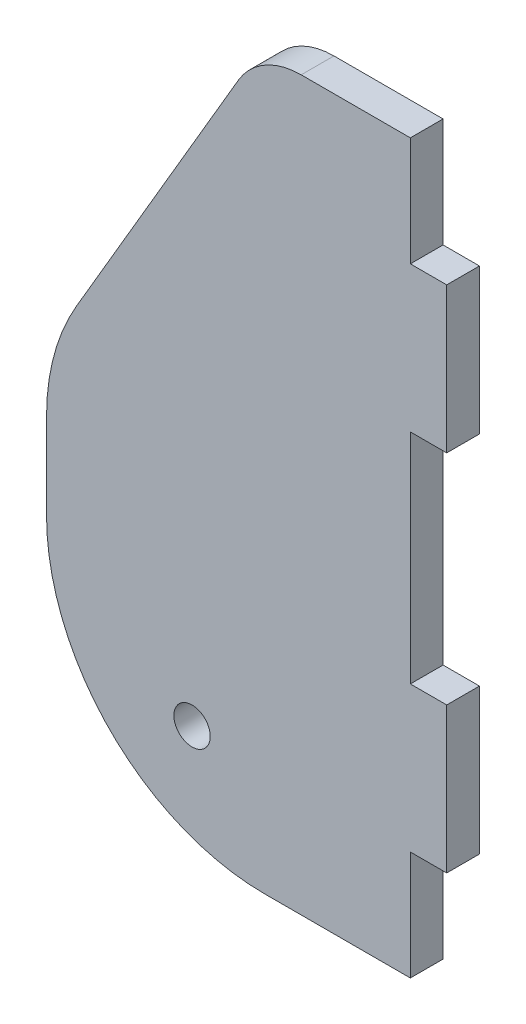
ISO-10303-21;
HEADER;
FILE_DESCRIPTION(('STEP AP214'),'2;1');
FILE_NAME('part.step','',(''),(''),'','','');
FILE_SCHEMA(('AUTOMOTIVE_DESIGN { 1 0 10303 214 1 1 1 1 }'));
ENDSEC;
DATA;
#1=APPLICATION_CONTEXT('core data for automotive mechanical design processes');
#2=APPLICATION_PROTOCOL_DEFINITION('international standard','automotive_design',2000,#1);
#3=PRODUCT_CONTEXT('',#1,'mechanical');
#4=PRODUCT('Part','Part','',(#3));
#5=PRODUCT_RELATED_PRODUCT_CATEGORY('part','',(#4));
#6=PRODUCT_DEFINITION_FORMATION('','',#4);
#7=PRODUCT_DEFINITION_CONTEXT('part definition',#1,'design');
#8=PRODUCT_DEFINITION('design','',#6,#7);
#9=PRODUCT_DEFINITION_SHAPE('','',#8);
#10=(LENGTH_UNIT() NAMED_UNIT(*) SI_UNIT(.MILLI.,.METRE.));
#11=(NAMED_UNIT(*) PLANE_ANGLE_UNIT() SI_UNIT($,.RADIAN.));
#12=(NAMED_UNIT(*) SI_UNIT($,.STERADIAN.) SOLID_ANGLE_UNIT());
#13=UNCERTAINTY_MEASURE_WITH_UNIT(LENGTH_MEASURE(1.E-05),#10,'distance_accuracy_value','');
#14=(GEOMETRIC_REPRESENTATION_CONTEXT(3) GLOBAL_UNCERTAINTY_ASSIGNED_CONTEXT((#13)) GLOBAL_UNIT_ASSIGNED_CONTEXT((#10,
#11,#12)) REPRESENTATION_CONTEXT('',''));
#15=CARTESIAN_POINT('',(0.,0.,0.));
#16=DIRECTION('',(0.,0.,1.));
#17=DIRECTION('',(1.,0.,0.));
#18=AXIS2_PLACEMENT_3D('',#15,#16,#17);
#19=CARTESIAN_POINT('',(-5.00000000000002,40.,4.5));
#20=DIRECTION('',(0.,0.,-1.));
#21=DIRECTION('',(-1.,0.,0.));
#22=AXIS2_PLACEMENT_3D('',#19,#20,#21);
#23=CYLINDRICAL_SURFACE('',#22,10.);
#24=CARTESIAN_POINT('',(-5.00000000000002,40.,0.));
#25=DIRECTION('',(0.,0.,1.));
#26=DIRECTION('',(1.,0.,0.));
#27=AXIS2_PLACEMENT_3D('',#24,#25,#26);
#28=CIRCLE('',#27,10.);
#29=CARTESIAN_POINT('',(-13.630305493034,45.0515173064048,0.));
#30=VERTEX_POINT('',#29);
#31=CARTESIAN_POINT('',(-5.00000000000002,50.,0.));
#32=VERTEX_POINT('',#31);
#33=EDGE_CURVE('E166',#30,#32,#28,.F.);
#34=ORIENTED_EDGE('',*,*,#33,.F.);
#35=DIRECTION('',(0.,0.,1.));
#36=VECTOR('',#35,1.);
#37=CARTESIAN_POINT('',(-13.630305493034,45.0515173064048,0.));
#38=LINE('',#37,#36);
#39=CARTESIAN_POINT('',(-13.630305493034,45.0515173064048,4.5));
#40=VERTEX_POINT('',#39);
#41=EDGE_CURVE('E153',#30,#40,#38,.T.);
#42=ORIENTED_EDGE('',*,*,#41,.T.);
#43=CARTESIAN_POINT('',(-5.00000000000002,40.,4.5));
#44=DIRECTION('',(0.,0.,1.));
#45=DIRECTION('',(1.,0.,0.));
#46=AXIS2_PLACEMENT_3D('',#43,#44,#45);
#47=CIRCLE('',#46,10.);
#48=CARTESIAN_POINT('',(-5.00000000000002,50.,4.5));
#49=VERTEX_POINT('',#48);
#50=EDGE_CURVE('E172',#49,#40,#47,.T.);
#51=ORIENTED_EDGE('',*,*,#50,.F.);
#52=DIRECTION('',(0.,0.,-1.));
#53=VECTOR('',#52,1.);
#54=CARTESIAN_POINT('',(-5.00000000000002,50.,4.5));
#55=LINE('',#54,#53);
#56=EDGE_CURVE('E171',#32,#49,#55,.F.);
#57=ORIENTED_EDGE('',*,*,#56,.F.);
#58=EDGE_LOOP('',(#34,#42,#51,#57));
#59=FACE_BOUND('',#58,.T.);
#60=ADVANCED_FACE('F37',(#59),#23,.T.);
#61=CARTESIAN_POINT('',(9.99999999999999,0.,4.5));
#62=DIRECTION('',(-1.,0.,0.));
#63=DIRECTION('',(0.,0.,1.));
#64=AXIS2_PLACEMENT_3D('',#61,#62,#63);
#65=PLANE('',#64);
#66=DIRECTION('',(0.,1.,0.));
#67=VECTOR('',#66,1.);
#68=CARTESIAN_POINT('',(9.99999999999999,0.,0.));
#69=LINE('',#68,#67);
#70=CARTESIAN_POINT('',(9.99999999999999,-50.,0.));
#71=VERTEX_POINT('',#70);
#72=CARTESIAN_POINT('',(9.99999999999998,-35.,0.));
#73=VERTEX_POINT('',#72);
#74=EDGE_CURVE('E163',#71,#73,#69,.T.);
#75=ORIENTED_EDGE('',*,*,#74,.T.);
#76=DIRECTION('',(0.,0.,-1.));
#77=VECTOR('',#76,1.);
#78=CARTESIAN_POINT('',(9.99999999999998,-35.,4.5));
#79=LINE('',#78,#77);
#80=CARTESIAN_POINT('',(9.99999999999998,-35.,4.5));
#81=VERTEX_POINT('',#80);
#82=EDGE_CURVE('E173',#81,#73,#79,.T.);
#83=ORIENTED_EDGE('',*,*,#82,.F.);
#84=DIRECTION('',(0.,1.,0.));
#85=VECTOR('',#84,1.);
#86=CARTESIAN_POINT('',(9.99999999999999,0.,4.5));
#87=LINE('',#86,#85);
#88=CARTESIAN_POINT('',(9.99999999999999,-50.,4.5));
#89=VERTEX_POINT('',#88);
#90=EDGE_CURVE('E242',#89,#81,#87,.T.);
#91=ORIENTED_EDGE('',*,*,#90,.F.);
#92=DIRECTION('',(0.,0.,-1.));
#93=VECTOR('',#92,1.);
#94=CARTESIAN_POINT('',(9.99999999999999,-50.,4.5));
#95=LINE('',#94,#93);
#96=EDGE_CURVE('E212',#89,#71,#95,.T.);
#97=ORIENTED_EDGE('',*,*,#96,.T.);
#98=EDGE_LOOP('',(#75,#83,#91,#97));
#99=FACE_BOUND('',#98,.T.);
#100=ADVANCED_FACE('F277',(#99),#65,.F.);
#101=CARTESIAN_POINT('',(0.,-35.,4.5));
#102=DIRECTION('',(0.,-1.,0.));
#103=DIRECTION('',(0.,0.,-1.));
#104=AXIS2_PLACEMENT_3D('',#101,#102,#103);
#105=PLANE('',#104);
#106=DIRECTION('',(-1.,0.,0.));
#107=VECTOR('',#106,1.);
#108=CARTESIAN_POINT('',(0.,-35.,0.));
#109=LINE('',#108,#107);
#110=CARTESIAN_POINT('',(15.,-35.,0.));
#111=VERTEX_POINT('',#110);
#112=EDGE_CURVE('E224',#111,#73,#109,.T.);
#113=ORIENTED_EDGE('',*,*,#112,.F.);
#114=DIRECTION('',(0.,0.,-1.));
#115=VECTOR('',#114,1.);
#116=CARTESIAN_POINT('',(15.,-35.,4.5));
#117=LINE('',#116,#115);
#118=CARTESIAN_POINT('',(15.,-35.,4.5));
#119=VERTEX_POINT('',#118);
#120=EDGE_CURVE('E176',#119,#111,#117,.T.);
#121=ORIENTED_EDGE('',*,*,#120,.F.);
#122=DIRECTION('',(-1.,0.,0.));
#123=VECTOR('',#122,1.);
#124=CARTESIAN_POINT('',(0.,-35.,4.5));
#125=LINE('',#124,#123);
#126=EDGE_CURVE('E275',#119,#81,#125,.T.);
#127=ORIENTED_EDGE('',*,*,#126,.T.);
#128=ORIENTED_EDGE('',*,*,#82,.T.);
#129=EDGE_LOOP('',(#113,#121,#127,#128));
#130=FACE_BOUND('',#129,.T.);
#131=ADVANCED_FACE('F273',(#130),#105,.T.);
#132=CARTESIAN_POINT('',(15.,0.,4.5));
#133=DIRECTION('',(-1.,0.,0.));
#134=DIRECTION('',(0.,0.,1.));
#135=AXIS2_PLACEMENT_3D('',#132,#133,#134);
#136=PLANE('',#135);
#137=DIRECTION('',(0.,1.,0.));
#138=VECTOR('',#137,1.);
#139=CARTESIAN_POINT('',(15.,0.,0.));
#140=LINE('',#139,#138);
#141=CARTESIAN_POINT('',(15.,-15.,0.));
#142=VERTEX_POINT('',#141);
#143=EDGE_CURVE('E229',#111,#142,#140,.T.);
#144=ORIENTED_EDGE('',*,*,#143,.T.);
#145=DIRECTION('',(0.,0.,-1.));
#146=VECTOR('',#145,1.);
#147=CARTESIAN_POINT('',(15.,-15.,4.5));
#148=LINE('',#147,#146);
#149=CARTESIAN_POINT('',(15.,-15.,4.5));
#150=VERTEX_POINT('',#149);
#151=EDGE_CURVE('E259',#150,#142,#148,.T.);
#152=ORIENTED_EDGE('',*,*,#151,.F.);
#153=DIRECTION('',(0.,1.,0.));
#154=VECTOR('',#153,1.);
#155=CARTESIAN_POINT('',(15.,0.,4.5));
#156=LINE('',#155,#154);
#157=EDGE_CURVE('E266',#119,#150,#156,.T.);
#158=ORIENTED_EDGE('',*,*,#157,.F.);
#159=ORIENTED_EDGE('',*,*,#120,.T.);
#160=EDGE_LOOP('',(#144,#152,#158,#159));
#161=FACE_BOUND('',#160,.T.);
#162=ADVANCED_FACE('F264',(#161),#136,.F.);
#163=CARTESIAN_POINT('',(0.,-15.,4.5));
#164=DIRECTION('',(0.,-1.,0.));
#165=DIRECTION('',(0.,0.,-1.));
#166=AXIS2_PLACEMENT_3D('',#163,#164,#165);
#167=PLANE('',#166);
#168=DIRECTION('',(-1.,0.,0.));
#169=VECTOR('',#168,1.);
#170=CARTESIAN_POINT('',(0.,-15.,0.));
#171=LINE('',#170,#169);
#172=CARTESIAN_POINT('',(9.99999999999998,-15.,0.));
#173=VERTEX_POINT('',#172);
#174=EDGE_CURVE('E231',#142,#173,#171,.T.);
#175=ORIENTED_EDGE('',*,*,#174,.T.);
#176=DIRECTION('',(0.,0.,-1.));
#177=VECTOR('',#176,1.);
#178=CARTESIAN_POINT('',(9.99999999999998,-15.,4.5));
#179=LINE('',#178,#177);
#180=CARTESIAN_POINT('',(9.99999999999998,-15.,4.5));
#181=VERTEX_POINT('',#180);
#182=EDGE_CURVE('E256',#181,#173,#179,.T.);
#183=ORIENTED_EDGE('',*,*,#182,.F.);
#184=DIRECTION('',(-1.,0.,0.));
#185=VECTOR('',#184,1.);
#186=CARTESIAN_POINT('',(0.,-15.,4.5));
#187=LINE('',#186,#185);
#188=EDGE_CURVE('E284',#150,#181,#187,.T.);
#189=ORIENTED_EDGE('',*,*,#188,.F.);
#190=ORIENTED_EDGE('',*,*,#151,.T.);
#191=EDGE_LOOP('',(#175,#183,#189,#190));
#192=FACE_BOUND('',#191,.T.);
#193=ADVANCED_FACE('F369',(#192),#167,.F.);
#194=CARTESIAN_POINT('',(9.99999999999998,15.,0.));
#195=VERTEX_POINT('',#194);
#196=EDGE_CURVE('E226',#173,#195,#69,.T.);
#197=ORIENTED_EDGE('',*,*,#196,.T.);
#198=DIRECTION('',(0.,0.,-1.));
#199=VECTOR('',#198,1.);
#200=CARTESIAN_POINT('',(9.99999999999998,15.,4.5));
#201=LINE('',#200,#199);
#202=CARTESIAN_POINT('',(9.99999999999998,15.,4.5));
#203=VERTEX_POINT('',#202);
#204=EDGE_CURVE('E254',#203,#195,#201,.T.);
#205=ORIENTED_EDGE('',*,*,#204,.F.);
#206=EDGE_CURVE('E279',#181,#203,#87,.T.);
#207=ORIENTED_EDGE('',*,*,#206,.F.);
#208=ORIENTED_EDGE('',*,*,#182,.T.);
#209=EDGE_LOOP('',(#197,#205,#207,#208));
#210=FACE_BOUND('',#209,.T.);
#211=ADVANCED_FACE('F337',(#210),#65,.F.);
#212=CARTESIAN_POINT('',(0.,15.,4.5));
#213=DIRECTION('',(0.,-1.,0.));
#214=DIRECTION('',(0.,0.,-1.));
#215=AXIS2_PLACEMENT_3D('',#212,#213,#214);
#216=PLANE('',#215);
#217=DIRECTION('',(-1.,0.,0.));
#218=VECTOR('',#217,1.);
#219=CARTESIAN_POINT('',(0.,15.,0.));
#220=LINE('',#219,#218);
#221=CARTESIAN_POINT('',(15.,15.,0.));
#222=VERTEX_POINT('',#221);
#223=EDGE_CURVE('E233',#222,#195,#220,.T.);
#224=ORIENTED_EDGE('',*,*,#223,.F.);
#225=DIRECTION('',(0.,0.,-1.));
#226=VECTOR('',#225,1.);
#227=CARTESIAN_POINT('',(15.,15.,4.5));
#228=LINE('',#227,#226);
#229=CARTESIAN_POINT('',(15.,15.,4.5));
#230=VERTEX_POINT('',#229);
#231=EDGE_CURVE('E252',#230,#222,#228,.T.);
#232=ORIENTED_EDGE('',*,*,#231,.F.);
#233=DIRECTION('',(-1.,0.,0.));
#234=VECTOR('',#233,1.);
#235=CARTESIAN_POINT('',(0.,15.,4.5));
#236=LINE('',#235,#234);
#237=EDGE_CURVE('E283',#230,#203,#236,.T.);
#238=ORIENTED_EDGE('',*,*,#237,.T.);
#239=ORIENTED_EDGE('',*,*,#204,.T.);
#240=EDGE_LOOP('',(#224,#232,#238,#239));
#241=FACE_BOUND('',#240,.T.);
#242=ADVANCED_FACE('F364',(#241),#216,.T.);
#243=CARTESIAN_POINT('',(15.,0.,4.5));
#244=DIRECTION('',(-1.,0.,0.));
#245=DIRECTION('',(0.,0.,1.));
#246=AXIS2_PLACEMENT_3D('',#243,#244,#245);
#247=PLANE('',#246);
#248=DIRECTION('',(0.,1.,0.));
#249=VECTOR('',#248,1.);
#250=CARTESIAN_POINT('',(15.,0.,0.));
#251=LINE('',#250,#249);
#252=CARTESIAN_POINT('',(15.,35.,0.));
#253=VERTEX_POINT('',#252);
#254=EDGE_CURVE('E236',#222,#253,#251,.T.);
#255=ORIENTED_EDGE('',*,*,#254,.T.);
#256=DIRECTION('',(0.,0.,-1.));
#257=VECTOR('',#256,1.);
#258=CARTESIAN_POINT('',(15.,35.,4.5));
#259=LINE('',#258,#257);
#260=CARTESIAN_POINT('',(15.,35.,4.5));
#261=VERTEX_POINT('',#260);
#262=EDGE_CURVE('E249',#261,#253,#259,.T.);
#263=ORIENTED_EDGE('',*,*,#262,.F.);
#264=DIRECTION('',(0.,1.,0.));
#265=VECTOR('',#264,1.);
#266=CARTESIAN_POINT('',(15.,0.,4.5));
#267=LINE('',#266,#265);
#268=EDGE_CURVE('E289',#230,#261,#267,.T.);
#269=ORIENTED_EDGE('',*,*,#268,.F.);
#270=ORIENTED_EDGE('',*,*,#231,.T.);
#271=EDGE_LOOP('',(#255,#263,#269,#270));
#272=FACE_BOUND('',#271,.T.);
#273=ADVANCED_FACE('F361',(#272),#247,.F.);
#274=CARTESIAN_POINT('',(0.,35.,4.5));
#275=DIRECTION('',(0.,-1.,0.));
#276=DIRECTION('',(0.,0.,-1.));
#277=AXIS2_PLACEMENT_3D('',#274,#275,#276);
#278=PLANE('',#277);
#279=DIRECTION('',(-1.,0.,0.));
#280=VECTOR('',#279,1.);
#281=CARTESIAN_POINT('',(0.,35.,0.));
#282=LINE('',#281,#280);
#283=CARTESIAN_POINT('',(9.99999999999998,35.,0.));
#284=VERTEX_POINT('',#283);
#285=EDGE_CURVE('E238',#253,#284,#282,.T.);
#286=ORIENTED_EDGE('',*,*,#285,.T.);
#287=DIRECTION('',(0.,0.,-1.));
#288=VECTOR('',#287,1.);
#289=CARTESIAN_POINT('',(9.99999999999998,35.,4.5));
#290=LINE('',#289,#288);
#291=CARTESIAN_POINT('',(9.99999999999998,35.,4.5));
#292=VERTEX_POINT('',#291);
#293=EDGE_CURVE('E246',#292,#284,#290,.T.);
#294=ORIENTED_EDGE('',*,*,#293,.F.);
#295=DIRECTION('',(-1.,0.,0.));
#296=VECTOR('',#295,1.);
#297=CARTESIAN_POINT('',(0.,35.,4.5));
#298=LINE('',#297,#296);
#299=EDGE_CURVE('E282',#261,#292,#298,.T.);
#300=ORIENTED_EDGE('',*,*,#299,.F.);
#301=ORIENTED_EDGE('',*,*,#262,.T.);
#302=EDGE_LOOP('',(#286,#294,#300,#301));
#303=FACE_BOUND('',#302,.T.);
#304=ADVANCED_FACE('F304',(#303),#278,.F.);
#305=CARTESIAN_POINT('',(9.99999999999999,50.,0.));
#306=VERTEX_POINT('',#305);
#307=EDGE_CURVE('E225',#284,#306,#69,.T.);
#308=ORIENTED_EDGE('',*,*,#307,.T.);
#309=DIRECTION('',(0.,0.,-1.));
#310=VECTOR('',#309,1.);
#311=CARTESIAN_POINT('',(9.99999999999999,50.,4.5));
#312=LINE('',#311,#310);
#313=CARTESIAN_POINT('',(9.99999999999999,50.,4.5));
#314=VERTEX_POINT('',#313);
#315=EDGE_CURVE('E216',#314,#306,#312,.T.);
#316=ORIENTED_EDGE('',*,*,#315,.F.);
#317=EDGE_CURVE('E218',#292,#314,#87,.T.);
#318=ORIENTED_EDGE('',*,*,#317,.F.);
#319=ORIENTED_EDGE('',*,*,#293,.T.);
#320=EDGE_LOOP('',(#308,#316,#318,#319));
#321=FACE_BOUND('',#320,.T.);
#322=ADVANCED_FACE('F309',(#321),#65,.F.);
#323=CARTESIAN_POINT('',(0.,50.,4.5));
#324=DIRECTION('',(0.,1.,0.));
#325=DIRECTION('',(-1.,0.,0.));
#326=AXIS2_PLACEMENT_3D('',#323,#324,#325);
#327=PLANE('',#326);
#328=DIRECTION('',(1.,0.,0.));
#329=VECTOR('',#328,1.);
#330=CARTESIAN_POINT('',(0.,50.,0.));
#331=LINE('',#330,#329);
#332=EDGE_CURVE('E240',#32,#306,#331,.T.);
#333=ORIENTED_EDGE('',*,*,#332,.F.);
#334=ORIENTED_EDGE('',*,*,#56,.T.);
#335=DIRECTION('',(1.,0.,0.));
#336=VECTOR('',#335,1.);
#337=CARTESIAN_POINT('',(0.,50.,4.5));
#338=LINE('',#337,#336);
#339=EDGE_CURVE('E214',#49,#314,#338,.T.);
#340=ORIENTED_EDGE('',*,*,#339,.T.);
#341=ORIENTED_EDGE('',*,*,#315,.T.);
#342=EDGE_LOOP('',(#333,#334,#340,#341));
#343=FACE_BOUND('',#342,.T.);
#344=ADVANCED_FACE('F311',(#343),#327,.T.);
#345=CARTESIAN_POINT('',(0.,-50.,4.5));
#346=DIRECTION('',(0.,1.,0.));
#347=DIRECTION('',(0.,0.,1.));
#348=AXIS2_PLACEMENT_3D('',#345,#346,#347);
#349=PLANE('',#348);
#350=DIRECTION('',(1.,0.,0.));
#351=VECTOR('',#350,1.);
#352=CARTESIAN_POINT('',(0.,-50.,4.5));
#353=LINE('',#352,#351);
#354=CARTESIAN_POINT('',(-10.,-50.,4.5));
#355=VERTEX_POINT('',#354);
#356=EDGE_CURVE('E207',#355,#89,#353,.T.);
#357=ORIENTED_EDGE('',*,*,#356,.F.);
#358=DIRECTION('',(0.,0.,1.));
#359=VECTOR('',#358,1.);
#360=CARTESIAN_POINT('',(-10.,-50.,0.));
#361=LINE('',#360,#359);
#362=CARTESIAN_POINT('',(-10.,-50.,0.));
#363=VERTEX_POINT('',#362);
#364=EDGE_CURVE('E61',#355,#363,#361,.F.);
#365=ORIENTED_EDGE('',*,*,#364,.T.);
#366=DIRECTION('',(1.,0.,0.));
#367=VECTOR('',#366,1.);
#368=CARTESIAN_POINT('',(0.,-50.,0.));
#369=LINE('',#368,#367);
#370=EDGE_CURVE('E195',#363,#71,#369,.T.);
#371=ORIENTED_EDGE('',*,*,#370,.T.);
#372=ORIENTED_EDGE('',*,*,#96,.F.);
#373=EDGE_LOOP('',(#357,#365,#371,#372));
#374=FACE_BOUND('',#373,.T.);
#375=ADVANCED_FACE('F210',(#374),#349,.F.);
#376=CARTESIAN_POINT('',(0.,0.,4.5));
#377=DIRECTION('',(0.,0.,1.));
#378=DIRECTION('',(1.,0.,0.));
#379=AXIS2_PLACEMENT_3D('',#376,#377,#378);
#380=PLANE('',#379);
#381=CARTESIAN_POINT('',(-20.,-35.,4.5));
#382=DIRECTION('',(0.,0.,1.));
#383=DIRECTION('',(1.,0.,0.));
#384=AXIS2_PLACEMENT_3D('',#381,#382,#383);
#385=CIRCLE('',#384,2.5);
#386=CARTESIAN_POINT('',(-17.5,-35.,4.5));
#387=VERTEX_POINT('',#386);
#388=EDGE_CURVE('E315',#387,#387,#385,.T.);
#389=ORIENTED_EDGE('',*,*,#388,.F.);
#390=EDGE_LOOP('',(#389));
#391=FACE_BOUND('',#390,.T.);
#392=DIRECTION('',(0.,-1.,0.));
#393=VECTOR('',#392,1.);
#394=CARTESIAN_POINT('',(-40.,0.,4.5));
#395=LINE('',#394,#393);
#396=CARTESIAN_POINT('',(-40.,-8.13435502970183,4.5));
#397=VERTEX_POINT('',#396);
#398=CARTESIAN_POINT('',(-40.,-20.,4.5));
#399=VERTEX_POINT('',#398);
#400=EDGE_CURVE('E209',#397,#399,#395,.T.);
#401=ORIENTED_EDGE('',*,*,#400,.T.);
#402=CARTESIAN_POINT('',(-10.,-20.,4.5));
#403=DIRECTION('',(0.,0.,1.));
#404=DIRECTION('',(1.,0.,0.));
#405=AXIS2_PLACEMENT_3D('',#402,#403,#404);
#406=CIRCLE('',#405,30.);
#407=EDGE_CURVE('E188',#399,#355,#406,.T.);
#408=ORIENTED_EDGE('',*,*,#407,.T.);
#409=ORIENTED_EDGE('',*,*,#356,.T.);
#410=ORIENTED_EDGE('',*,*,#90,.T.);
#411=ORIENTED_EDGE('',*,*,#126,.F.);
#412=ORIENTED_EDGE('',*,*,#157,.T.);
#413=ORIENTED_EDGE('',*,*,#188,.T.);
#414=ORIENTED_EDGE('',*,*,#206,.T.);
#415=ORIENTED_EDGE('',*,*,#237,.F.);
#416=ORIENTED_EDGE('',*,*,#268,.T.);
#417=ORIENTED_EDGE('',*,*,#299,.T.);
#418=ORIENTED_EDGE('',*,*,#317,.T.);
#419=ORIENTED_EDGE('',*,*,#339,.F.);
#420=ORIENTED_EDGE('',*,*,#50,.T.);
#421=DIRECTION('',(-0.505151730640476,-0.863030549303402,0.));
#422=VECTOR('',#421,1.);
#423=CARTESIAN_POINT('',(-40.,0.,4.5));
#424=LINE('',#423,#422);
#425=CARTESIAN_POINT('',(-35.8909164791021,7.02019688951246,4.5));
#426=VERTEX_POINT('',#425);
#427=EDGE_CURVE('E158',#40,#426,#424,.T.);
#428=ORIENTED_EDGE('',*,*,#427,.T.);
#429=CARTESIAN_POINT('',(-10.,-8.13435502970182,4.5));
#430=DIRECTION('',(0.,0.,1.));
#431=DIRECTION('',(1.,0.,0.));
#432=AXIS2_PLACEMENT_3D('',#429,#430,#431);
#433=CIRCLE('',#432,30.);
#434=EDGE_CURVE('E186',#426,#397,#433,.T.);
#435=ORIENTED_EDGE('',*,*,#434,.T.);
#436=EDGE_LOOP('',(#401,#408,#409,#410,#411,#412,#413,#414,#415,#416,#417,#418,#419,#420,#428,#435));
#437=FACE_BOUND('',#436,.T.);
#438=ADVANCED_FACE('F206',(#391,#437),#380,.T.);
#439=CARTESIAN_POINT('',(0.,0.,0.));
#440=DIRECTION('',(0.,0.,1.));
#441=DIRECTION('',(1.,0.,0.));
#442=AXIS2_PLACEMENT_3D('',#439,#440,#441);
#443=PLANE('',#442);
#444=CARTESIAN_POINT('',(-20.,-35.,0.));
#445=DIRECTION('',(0.,0.,1.));
#446=DIRECTION('',(1.,0.,0.));
#447=AXIS2_PLACEMENT_3D('',#444,#445,#446);
#448=CIRCLE('',#447,2.5);
#449=CARTESIAN_POINT('',(-17.5,-35.,0.));
#450=VERTEX_POINT('',#449);
#451=EDGE_CURVE('E41',#450,#450,#448,.T.);
#452=ORIENTED_EDGE('',*,*,#451,.T.);
#453=EDGE_LOOP('',(#452));
#454=FACE_BOUND('',#453,.T.);
#455=ORIENTED_EDGE('',*,*,#370,.F.);
#456=CARTESIAN_POINT('',(-10.,-20.,0.));
#457=DIRECTION('',(0.,0.,1.));
#458=DIRECTION('',(1.,0.,0.));
#459=AXIS2_PLACEMENT_3D('',#456,#457,#458);
#460=CIRCLE('',#459,30.);
#461=CARTESIAN_POINT('',(-40.,-20.,0.));
#462=VERTEX_POINT('',#461);
#463=EDGE_CURVE('E46',#363,#462,#460,.F.);
#464=ORIENTED_EDGE('',*,*,#463,.T.);
#465=DIRECTION('',(0.,-1.,0.));
#466=VECTOR('',#465,1.);
#467=CARTESIAN_POINT('',(-40.,0.,0.));
#468=LINE('',#467,#466);
#469=CARTESIAN_POINT('',(-40.,-8.13435502970183,0.));
#470=VERTEX_POINT('',#469);
#471=EDGE_CURVE('E168',#470,#462,#468,.T.);
#472=ORIENTED_EDGE('',*,*,#471,.F.);
#473=CARTESIAN_POINT('',(-10.,-8.13435502970182,0.));
#474=DIRECTION('',(0.,0.,1.));
#475=DIRECTION('',(1.,0.,0.));
#476=AXIS2_PLACEMENT_3D('',#473,#474,#475);
#477=CIRCLE('',#476,30.);
#478=CARTESIAN_POINT('',(-35.8909164791021,7.02019688951246,0.));
#479=VERTEX_POINT('',#478);
#480=EDGE_CURVE('E53',#470,#479,#477,.F.);
#481=ORIENTED_EDGE('',*,*,#480,.T.);
#482=DIRECTION('',(-0.505151730640476,-0.863030549303402,0.));
#483=VECTOR('',#482,1.);
#484=CARTESIAN_POINT('',(-40.,0.,0.));
#485=LINE('',#484,#483);
#486=EDGE_CURVE('E155',#30,#479,#485,.T.);
#487=ORIENTED_EDGE('',*,*,#486,.F.);
#488=ORIENTED_EDGE('',*,*,#33,.T.);
#489=ORIENTED_EDGE('',*,*,#332,.T.);
#490=ORIENTED_EDGE('',*,*,#307,.F.);
#491=ORIENTED_EDGE('',*,*,#285,.F.);
#492=ORIENTED_EDGE('',*,*,#254,.F.);
#493=ORIENTED_EDGE('',*,*,#223,.T.);
#494=ORIENTED_EDGE('',*,*,#196,.F.);
#495=ORIENTED_EDGE('',*,*,#174,.F.);
#496=ORIENTED_EDGE('',*,*,#143,.F.);
#497=ORIENTED_EDGE('',*,*,#112,.T.);
#498=ORIENTED_EDGE('',*,*,#74,.F.);
#499=EDGE_LOOP('',(#455,#464,#472,#481,#487,#488,#489,#490,#491,#492,#493,#494,#495,#496,#497,#498));
#500=FACE_BOUND('',#499,.T.);
#501=ADVANCED_FACE('F165',(#454,#500),#443,.F.);
#502=CARTESIAN_POINT('',(-40.,0.,0.));
#503=DIRECTION('',(-1.,0.,0.));
#504=DIRECTION('',(0.,-1.,0.));
#505=AXIS2_PLACEMENT_3D('',#502,#503,#504);
#506=PLANE('',#505);
#507=ORIENTED_EDGE('',*,*,#471,.T.);
#508=DIRECTION('',(0.,0.,1.));
#509=VECTOR('',#508,1.);
#510=CARTESIAN_POINT('',(-40.,-20.,4.5));
#511=LINE('',#510,#509);
#512=EDGE_CURVE('E183',#462,#399,#511,.T.);
#513=ORIENTED_EDGE('',*,*,#512,.T.);
#514=ORIENTED_EDGE('',*,*,#400,.F.);
#515=DIRECTION('',(0.,0.,1.));
#516=VECTOR('',#515,1.);
#517=CARTESIAN_POINT('',(-40.,-8.13435502970183,0.));
#518=LINE('',#517,#516);
#519=EDGE_CURVE('E181',#397,#470,#518,.F.);
#520=ORIENTED_EDGE('',*,*,#519,.T.);
#521=EDGE_LOOP('',(#507,#513,#514,#520));
#522=FACE_BOUND('',#521,.T.);
#523=ADVANCED_FACE('F199',(#522),#506,.T.);
#524=CARTESIAN_POINT('',(-40.,0.,0.));
#525=DIRECTION('',(-0.863030549303402,0.505151730640476,0.));
#526=DIRECTION('',(-0.505151730640476,-0.863030549303402,0.));
#527=AXIS2_PLACEMENT_3D('',#524,#525,#526);
#528=PLANE('',#527);
#529=ORIENTED_EDGE('',*,*,#486,.T.);
#530=DIRECTION('',(0.,0.,1.));
#531=VECTOR('',#530,1.);
#532=CARTESIAN_POINT('',(-35.8909164791021,7.02019688951246,0.));
#533=LINE('',#532,#531);
#534=EDGE_CURVE('E11',#479,#426,#533,.T.);
#535=ORIENTED_EDGE('',*,*,#534,.T.);
#536=ORIENTED_EDGE('',*,*,#427,.F.);
#537=ORIENTED_EDGE('',*,*,#41,.F.);
#538=EDGE_LOOP('',(#529,#535,#536,#537));
#539=FACE_BOUND('',#538,.T.);
#540=ADVANCED_FACE('F154',(#539),#528,.T.);
#541=CARTESIAN_POINT('',(-10.,-20.,0.));
#542=DIRECTION('',(0.,0.,-1.));
#543=DIRECTION('',(-1.,0.,0.));
#544=AXIS2_PLACEMENT_3D('',#541,#542,#543);
#545=CYLINDRICAL_SURFACE('',#544,30.);
#546=ORIENTED_EDGE('',*,*,#463,.F.);
#547=ORIENTED_EDGE('',*,*,#364,.F.);
#548=ORIENTED_EDGE('',*,*,#407,.F.);
#549=ORIENTED_EDGE('',*,*,#512,.F.);
#550=EDGE_LOOP('',(#546,#547,#548,#549));
#551=FACE_BOUND('',#550,.T.);
#552=ADVANCED_FACE('F204',(#551),#545,.T.);
#553=CARTESIAN_POINT('',(-10.,-8.13435502970182,0.));
#554=DIRECTION('',(0.,0.,1.));
#555=DIRECTION('',(1.,0.,0.));
#556=AXIS2_PLACEMENT_3D('',#553,#554,#555);
#557=CYLINDRICAL_SURFACE('',#556,30.);
#558=ORIENTED_EDGE('',*,*,#480,.F.);
#559=ORIENTED_EDGE('',*,*,#519,.F.);
#560=ORIENTED_EDGE('',*,*,#434,.F.);
#561=ORIENTED_EDGE('',*,*,#534,.F.);
#562=EDGE_LOOP('',(#558,#559,#560,#561));
#563=FACE_BOUND('',#562,.T.);
#564=ADVANCED_FACE('F39',(#563),#557,.T.);
#565=CARTESIAN_POINT('',(-20.,-35.,-0.5));
#566=DIRECTION('',(0.,0.,1.));
#567=DIRECTION('',(1.,0.,0.));
#568=AXIS2_PLACEMENT_3D('',#565,#566,#567);
#569=CYLINDRICAL_SURFACE('',#568,2.5);
#570=ORIENTED_EDGE('',*,*,#388,.T.);
#571=EDGE_LOOP('',(#570));
#572=FACE_BOUND('',#571,.T.);
#573=ORIENTED_EDGE('',*,*,#451,.F.);
#574=EDGE_LOOP('',(#573));
#575=FACE_BOUND('',#574,.T.);
#576=ADVANCED_FACE('F323',(#572,#575),#569,.F.);
#577=CLOSED_SHELL('',(#60,#100,#131,#162,#193,#211,#242,#273,#304,#322,#344,#375,#438,#501,#523,
#540,#552,#564,#576));
#578=MANIFOLD_SOLID_BREP('B2',#577);
#579=ADVANCED_BREP_SHAPE_REPRESENTATION('',(#18,#578),#14);
#580=SHAPE_DEFINITION_REPRESENTATION(#9,#579);
ENDSEC;
END-ISO-10303-21;
